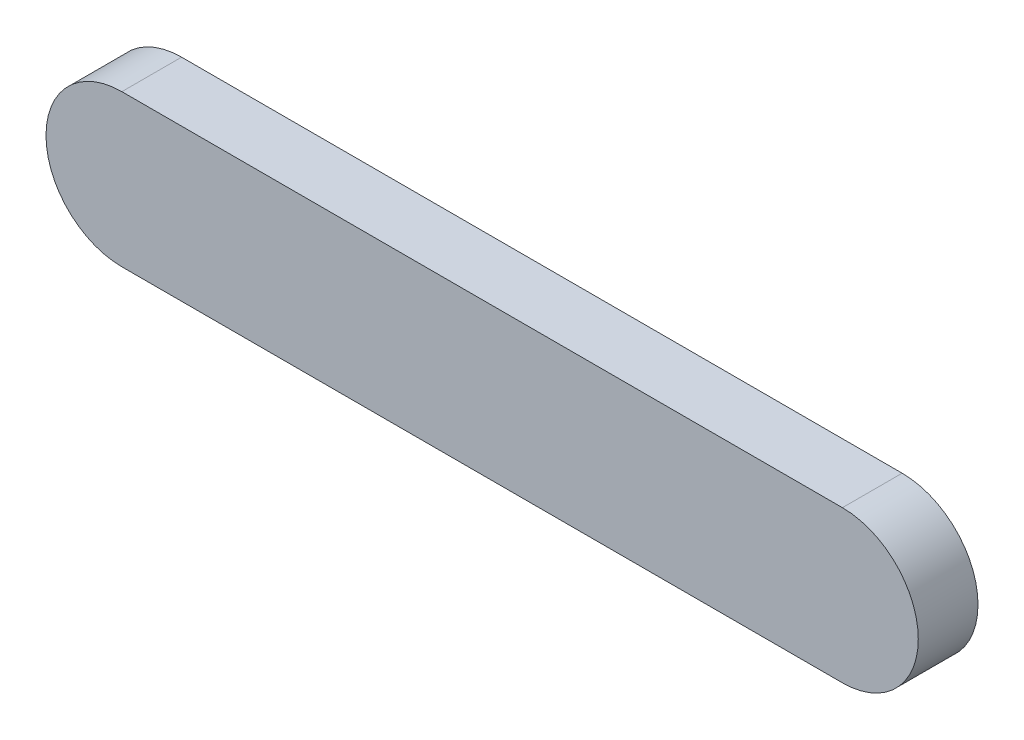
ISO-10303-21;
HEADER;
FILE_DESCRIPTION(('STEP AP214'),'2;1');
FILE_NAME('part.step','',(''),(''),'','','');
FILE_SCHEMA(('AUTOMOTIVE_DESIGN { 1 0 10303 214 1 1 1 1 }'));
ENDSEC;
DATA;
#1=APPLICATION_CONTEXT('core data for automotive mechanical design processes');
#2=APPLICATION_PROTOCOL_DEFINITION('international standard','automotive_design',2000,#1);
#3=PRODUCT_CONTEXT('',#1,'mechanical');
#4=PRODUCT('Part','Part','',(#3));
#5=PRODUCT_RELATED_PRODUCT_CATEGORY('part','',(#4));
#6=PRODUCT_DEFINITION_FORMATION('','',#4);
#7=PRODUCT_DEFINITION_CONTEXT('part definition',#1,'design');
#8=PRODUCT_DEFINITION('design','',#6,#7);
#9=PRODUCT_DEFINITION_SHAPE('','',#8);
#10=(LENGTH_UNIT() NAMED_UNIT(*) SI_UNIT(.MILLI.,.METRE.));
#11=(NAMED_UNIT(*) PLANE_ANGLE_UNIT() SI_UNIT($,.RADIAN.));
#12=(NAMED_UNIT(*) SI_UNIT($,.STERADIAN.) SOLID_ANGLE_UNIT());
#13=UNCERTAINTY_MEASURE_WITH_UNIT(LENGTH_MEASURE(1.E-05),#10,'distance_accuracy_value','');
#14=(GEOMETRIC_REPRESENTATION_CONTEXT(3) GLOBAL_UNCERTAINTY_ASSIGNED_CONTEXT((#13)) GLOBAL_UNIT_ASSIGNED_CONTEXT((#10,
#11,#12)) REPRESENTATION_CONTEXT('',''));
#15=CARTESIAN_POINT('',(0.,0.,0.));
#16=DIRECTION('',(0.,0.,1.));
#17=DIRECTION('',(1.,0.,0.));
#18=AXIS2_PLACEMENT_3D('',#15,#16,#17);
#19=CARTESIAN_POINT('',(88.9,119.761,0.));
#20=DIRECTION('',(0.,1.,0.));
#21=DIRECTION('',(1.,0.,0.));
#22=AXIS2_PLACEMENT_3D('',#19,#20,#21);
#23=PLANE('',#22);
#24=DIRECTION('',(1.,0.,0.));
#25=VECTOR('',#24,1.);
#26=CARTESIAN_POINT('',(88.9,119.761,0.1999996));
#27=LINE('',#26,#25);
#28=CARTESIAN_POINT('',(88.9,119.761,0.1999996));
#29=VERTEX_POINT('',#28);
#30=CARTESIAN_POINT('',(91.313,119.761,0.1999996));
#31=VERTEX_POINT('',#30);
#32=EDGE_CURVE('E11',#29,#31,#27,.T.);
#33=ORIENTED_EDGE('',*,*,#32,.F.);
#34=DIRECTION('',(0.,0.,1.));
#35=VECTOR('',#34,1.);
#36=CARTESIAN_POINT('',(88.9,119.761,0.));
#37=LINE('',#36,#35);
#38=CARTESIAN_POINT('',(88.9,119.761,0.));
#39=VERTEX_POINT('',#38);
#40=EDGE_CURVE('E24',#39,#29,#37,.T.);
#41=ORIENTED_EDGE('',*,*,#40,.F.);
#42=DIRECTION('',(1.,0.,0.));
#43=VECTOR('',#42,1.);
#44=CARTESIAN_POINT('',(88.9,119.761,0.));
#45=LINE('',#44,#43);
#46=CARTESIAN_POINT('',(91.313,119.761,0.));
#47=VERTEX_POINT('',#46);
#48=EDGE_CURVE('E75',#39,#47,#45,.T.);
#49=ORIENTED_EDGE('',*,*,#48,.T.);
#50=DIRECTION('',(0.,0.,1.));
#51=VECTOR('',#50,1.);
#52=CARTESIAN_POINT('',(91.313,119.761,0.));
#53=LINE('',#52,#51);
#54=EDGE_CURVE('E37',#47,#31,#53,.T.);
#55=ORIENTED_EDGE('',*,*,#54,.T.);
#56=EDGE_LOOP('',(#33,#41,#49,#55));
#57=FACE_BOUND('',#56,.T.);
#58=ADVANCED_FACE('F17',(#57),#23,.F.);
#59=CARTESIAN_POINT('',(91.313,120.015,0.));
#60=DIRECTION('',(0.,0.,-1.));
#61=DIRECTION('',(0.,-1.,0.));
#62=AXIS2_PLACEMENT_3D('',#59,#60,#61);
#63=CYLINDRICAL_SURFACE('',#62,0.254000000000005);
#64=CARTESIAN_POINT('',(91.313,120.015,0.1999996));
#65=DIRECTION('',(0.,0.,1.));
#66=DIRECTION('',(0.,-1.,0.));
#67=AXIS2_PLACEMENT_3D('',#64,#65,#66);
#68=CIRCLE('',#67,0.254000000000005);
#69=CARTESIAN_POINT('',(91.313,120.269,0.1999996));
#70=VERTEX_POINT('',#69);
#71=EDGE_CURVE('E83',#31,#70,#68,.T.);
#72=ORIENTED_EDGE('',*,*,#71,.F.);
#73=ORIENTED_EDGE('',*,*,#54,.F.);
#74=CARTESIAN_POINT('',(91.313,120.015,0.));
#75=DIRECTION('',(0.,0.,1.));
#76=DIRECTION('',(0.,-1.,0.));
#77=AXIS2_PLACEMENT_3D('',#74,#75,#76);
#78=CIRCLE('',#77,0.254000000000005);
#79=CARTESIAN_POINT('',(91.313,120.269,0.));
#80=VERTEX_POINT('',#79);
#81=EDGE_CURVE('E81',#47,#80,#78,.T.);
#82=ORIENTED_EDGE('',*,*,#81,.T.);
#83=DIRECTION('',(0.,0.,1.));
#84=VECTOR('',#83,1.);
#85=CARTESIAN_POINT('',(91.313,120.269,0.));
#86=LINE('',#85,#84);
#87=EDGE_CURVE('E67',#80,#70,#86,.T.);
#88=ORIENTED_EDGE('',*,*,#87,.T.);
#89=EDGE_LOOP('',(#72,#73,#82,#88));
#90=FACE_BOUND('',#89,.T.);
#91=ADVANCED_FACE('F89',(#90),#63,.T.);
#92=CARTESIAN_POINT('',(91.313,120.269,0.));
#93=DIRECTION('',(0.,-1.,0.));
#94=DIRECTION('',(-1.,0.,0.));
#95=AXIS2_PLACEMENT_3D('',#92,#93,#94);
#96=PLANE('',#95);
#97=DIRECTION('',(-1.,0.,0.));
#98=VECTOR('',#97,1.);
#99=CARTESIAN_POINT('',(91.313,120.269,0.1999996));
#100=LINE('',#99,#98);
#101=CARTESIAN_POINT('',(88.9,120.269,0.1999996));
#102=VERTEX_POINT('',#101);
#103=EDGE_CURVE('E71',#70,#102,#100,.T.);
#104=ORIENTED_EDGE('',*,*,#103,.F.);
#105=ORIENTED_EDGE('',*,*,#87,.F.);
#106=DIRECTION('',(-1.,0.,0.));
#107=VECTOR('',#106,1.);
#108=CARTESIAN_POINT('',(91.313,120.269,0.));
#109=LINE('',#108,#107);
#110=CARTESIAN_POINT('',(88.9,120.269,0.));
#111=VERTEX_POINT('',#110);
#112=EDGE_CURVE('E63',#80,#111,#109,.T.);
#113=ORIENTED_EDGE('',*,*,#112,.T.);
#114=DIRECTION('',(0.,0.,1.));
#115=VECTOR('',#114,1.);
#116=CARTESIAN_POINT('',(88.9,120.269,0.));
#117=LINE('',#116,#115);
#118=EDGE_CURVE('E53',#111,#102,#117,.T.);
#119=ORIENTED_EDGE('',*,*,#118,.T.);
#120=EDGE_LOOP('',(#104,#105,#113,#119));
#121=FACE_BOUND('',#120,.T.);
#122=ADVANCED_FACE('F66',(#121),#96,.F.);
#123=CARTESIAN_POINT('',(88.9,120.015,0.));
#124=DIRECTION('',(0.,0.,-1.));
#125=DIRECTION('',(0.,1.,0.));
#126=AXIS2_PLACEMENT_3D('',#123,#124,#125);
#127=CYLINDRICAL_SURFACE('',#126,0.254);
#128=CARTESIAN_POINT('',(88.9,120.015,0.1999996));
#129=DIRECTION('',(0.,0.,1.));
#130=DIRECTION('',(0.,1.,0.));
#131=AXIS2_PLACEMENT_3D('',#128,#129,#130);
#132=CIRCLE('',#131,0.254);
#133=EDGE_CURVE('E59',#102,#29,#132,.T.);
#134=ORIENTED_EDGE('',*,*,#133,.F.);
#135=ORIENTED_EDGE('',*,*,#118,.F.);
#136=CARTESIAN_POINT('',(88.9,120.015,0.));
#137=DIRECTION('',(0.,0.,1.));
#138=DIRECTION('',(0.,1.,0.));
#139=AXIS2_PLACEMENT_3D('',#136,#137,#138);
#140=CIRCLE('',#139,0.254);
#141=EDGE_CURVE('E57',#111,#39,#140,.T.);
#142=ORIENTED_EDGE('',*,*,#141,.T.);
#143=ORIENTED_EDGE('',*,*,#40,.T.);
#144=EDGE_LOOP('',(#134,#135,#142,#143));
#145=FACE_BOUND('',#144,.T.);
#146=ADVANCED_FACE('F55',(#145),#127,.T.);
#147=CARTESIAN_POINT('',(88.9,119.761,0.));
#148=DIRECTION('',(0.,0.,-1.));
#149=DIRECTION('',(-1.,0.,0.));
#150=AXIS2_PLACEMENT_3D('',#147,#148,#149);
#151=PLANE('',#150);
#152=ORIENTED_EDGE('',*,*,#141,.F.);
#153=ORIENTED_EDGE('',*,*,#112,.F.);
#154=ORIENTED_EDGE('',*,*,#81,.F.);
#155=ORIENTED_EDGE('',*,*,#48,.F.);
#156=EDGE_LOOP('',(#152,#153,#154,#155));
#157=FACE_BOUND('',#156,.T.);
#158=ADVANCED_FACE('F74',(#157),#151,.T.);
#159=CARTESIAN_POINT('',(88.9,119.761,0.1999996));
#160=DIRECTION('',(0.,0.,-1.));
#161=DIRECTION('',(-1.,0.,0.));
#162=AXIS2_PLACEMENT_3D('',#159,#160,#161);
#163=PLANE('',#162);
#164=ORIENTED_EDGE('',*,*,#32,.T.);
#165=ORIENTED_EDGE('',*,*,#71,.T.);
#166=ORIENTED_EDGE('',*,*,#103,.T.);
#167=ORIENTED_EDGE('',*,*,#133,.T.);
#168=EDGE_LOOP('',(#164,#165,#166,#167));
#169=FACE_BOUND('',#168,.T.);
#170=ADVANCED_FACE('F91',(#169),#163,.F.);
#171=CLOSED_SHELL('',(#58,#91,#122,#146,#158,#170));
#172=MANIFOLD_SOLID_BREP('B1',#171);
#173=ADVANCED_BREP_SHAPE_REPRESENTATION('',(#18,#172),#14);
#174=SHAPE_DEFINITION_REPRESENTATION(#9,#173);
ENDSEC;
END-ISO-10303-21;
